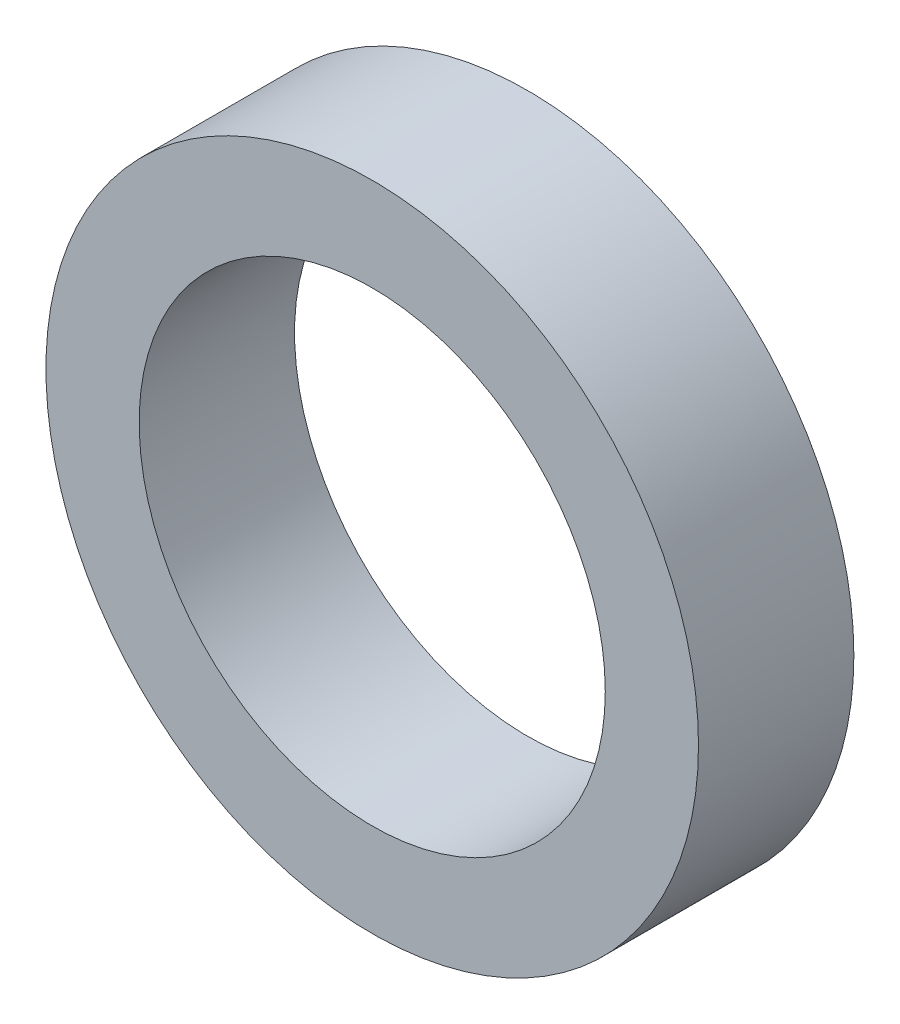
ISO-10303-21;
HEADER;
FILE_DESCRIPTION(('STEP AP214'),'2;1');
FILE_NAME('part.step','',(''),(''),'','','');
FILE_SCHEMA(('AUTOMOTIVE_DESIGN { 1 0 10303 214 1 1 1 1 }'));
ENDSEC;
DATA;
#1=APPLICATION_CONTEXT('core data for automotive mechanical design processes');
#2=APPLICATION_PROTOCOL_DEFINITION('international standard','automotive_design',2000,#1);
#3=PRODUCT_CONTEXT('',#1,'mechanical');
#4=PRODUCT('Part','Part','',(#3));
#5=PRODUCT_RELATED_PRODUCT_CATEGORY('part','',(#4));
#6=PRODUCT_DEFINITION_FORMATION('','',#4);
#7=PRODUCT_DEFINITION_CONTEXT('part definition',#1,'design');
#8=PRODUCT_DEFINITION('design','',#6,#7);
#9=PRODUCT_DEFINITION_SHAPE('','',#8);
#10=(LENGTH_UNIT() NAMED_UNIT(*) SI_UNIT(.MILLI.,.METRE.));
#11=(NAMED_UNIT(*) PLANE_ANGLE_UNIT() SI_UNIT($,.RADIAN.));
#12=(NAMED_UNIT(*) SI_UNIT($,.STERADIAN.) SOLID_ANGLE_UNIT());
#13=UNCERTAINTY_MEASURE_WITH_UNIT(LENGTH_MEASURE(1.E-05),#10,'distance_accuracy_value','');
#14=(GEOMETRIC_REPRESENTATION_CONTEXT(3) GLOBAL_UNCERTAINTY_ASSIGNED_CONTEXT((#13)) GLOBAL_UNIT_ASSIGNED_CONTEXT((#10,
#11,#12)) REPRESENTATION_CONTEXT('',''));
#15=CARTESIAN_POINT('',(0.,0.,0.));
#16=DIRECTION('',(0.,0.,1.));
#17=DIRECTION('',(1.,0.,0.));
#18=AXIS2_PLACEMENT_3D('',#15,#16,#17);
#19=CARTESIAN_POINT('',(0.,0.,5.));
#20=DIRECTION('',(0.,0.,1.));
#21=DIRECTION('',(1.,0.,0.));
#22=AXIS2_PLACEMENT_3D('',#19,#20,#21);
#23=PLANE('',#22);
#24=CARTESIAN_POINT('',(0.,0.,5.));
#25=DIRECTION('',(0.,0.,1.));
#26=DIRECTION('',(1.,0.,0.));
#27=AXIS2_PLACEMENT_3D('',#24,#25,#26);
#28=CIRCLE('',#27,10.5);
#29=CARTESIAN_POINT('',(10.5,0.,5.));
#30=VERTEX_POINT('',#29);
#31=EDGE_CURVE('E10',#30,#30,#28,.T.);
#32=ORIENTED_EDGE('',*,*,#31,.T.);
#33=EDGE_LOOP('',(#32));
#34=FACE_BOUND('',#33,.T.);
#35=CARTESIAN_POINT('',(0.,0.,5.));
#36=DIRECTION('',(0.,0.,1.));
#37=DIRECTION('',(1.,0.,0.));
#38=AXIS2_PLACEMENT_3D('',#35,#36,#37);
#39=CIRCLE('',#38,7.5);
#40=CARTESIAN_POINT('',(7.5,0.,5.));
#41=VERTEX_POINT('',#40);
#42=EDGE_CURVE('E49',#41,#41,#39,.T.);
#43=ORIENTED_EDGE('',*,*,#42,.F.);
#44=EDGE_LOOP('',(#43));
#45=FACE_BOUND('',#44,.T.);
#46=ADVANCED_FACE('F39',(#34,#45),#23,.T.);
#47=CARTESIAN_POINT('',(0.,0.,0.));
#48=DIRECTION('',(0.,0.,1.));
#49=DIRECTION('',(1.,0.,0.));
#50=AXIS2_PLACEMENT_3D('',#47,#48,#49);
#51=PLANE('',#50);
#52=CARTESIAN_POINT('',(0.,0.,0.));
#53=DIRECTION('',(0.,0.,1.));
#54=DIRECTION('',(1.,0.,0.));
#55=AXIS2_PLACEMENT_3D('',#52,#53,#54);
#56=CIRCLE('',#55,10.5);
#57=CARTESIAN_POINT('',(10.5,0.,0.));
#58=VERTEX_POINT('',#57);
#59=EDGE_CURVE('E43',#58,#58,#56,.T.);
#60=ORIENTED_EDGE('',*,*,#59,.F.);
#61=EDGE_LOOP('',(#60));
#62=FACE_BOUND('',#61,.T.);
#63=CARTESIAN_POINT('',(0.,0.,0.));
#64=DIRECTION('',(0.,0.,1.));
#65=DIRECTION('',(1.,0.,0.));
#66=AXIS2_PLACEMENT_3D('',#63,#64,#65);
#67=CIRCLE('',#66,7.5);
#68=CARTESIAN_POINT('',(7.5,0.,0.));
#69=VERTEX_POINT('',#68);
#70=EDGE_CURVE('E55',#69,#69,#67,.T.);
#71=ORIENTED_EDGE('',*,*,#70,.T.);
#72=EDGE_LOOP('',(#71));
#73=FACE_BOUND('',#72,.T.);
#74=ADVANCED_FACE('F65',(#62,#73),#51,.F.);
#75=CARTESIAN_POINT('',(0.,0.,5.));
#76=DIRECTION('',(0.,0.,-1.));
#77=DIRECTION('',(-1.,0.,0.));
#78=AXIS2_PLACEMENT_3D('',#75,#76,#77);
#79=CYLINDRICAL_SURFACE('',#78,10.5);
#80=ORIENTED_EDGE('',*,*,#31,.F.);
#81=EDGE_LOOP('',(#80));
#82=FACE_BOUND('',#81,.T.);
#83=ORIENTED_EDGE('',*,*,#59,.T.);
#84=EDGE_LOOP('',(#83));
#85=FACE_BOUND('',#84,.T.);
#86=ADVANCED_FACE('F41',(#82,#85),#79,.T.);
#87=CARTESIAN_POINT('',(0.,0.,5.));
#88=DIRECTION('',(0.,0.,-1.));
#89=DIRECTION('',(-1.,0.,0.));
#90=AXIS2_PLACEMENT_3D('',#87,#88,#89);
#91=CYLINDRICAL_SURFACE('',#90,7.5);
#92=ORIENTED_EDGE('',*,*,#42,.T.);
#93=EDGE_LOOP('',(#92));
#94=FACE_BOUND('',#93,.T.);
#95=ORIENTED_EDGE('',*,*,#70,.F.);
#96=EDGE_LOOP('',(#95));
#97=FACE_BOUND('',#96,.T.);
#98=ADVANCED_FACE('F59',(#94,#97),#91,.F.);
#99=CLOSED_SHELL('',(#46,#74,#86,#98));
#100=MANIFOLD_SOLID_BREP('B2',#99);
#101=ADVANCED_BREP_SHAPE_REPRESENTATION('',(#18,#100),#14);
#102=SHAPE_DEFINITION_REPRESENTATION(#9,#101);
ENDSEC;
END-ISO-10303-21;
